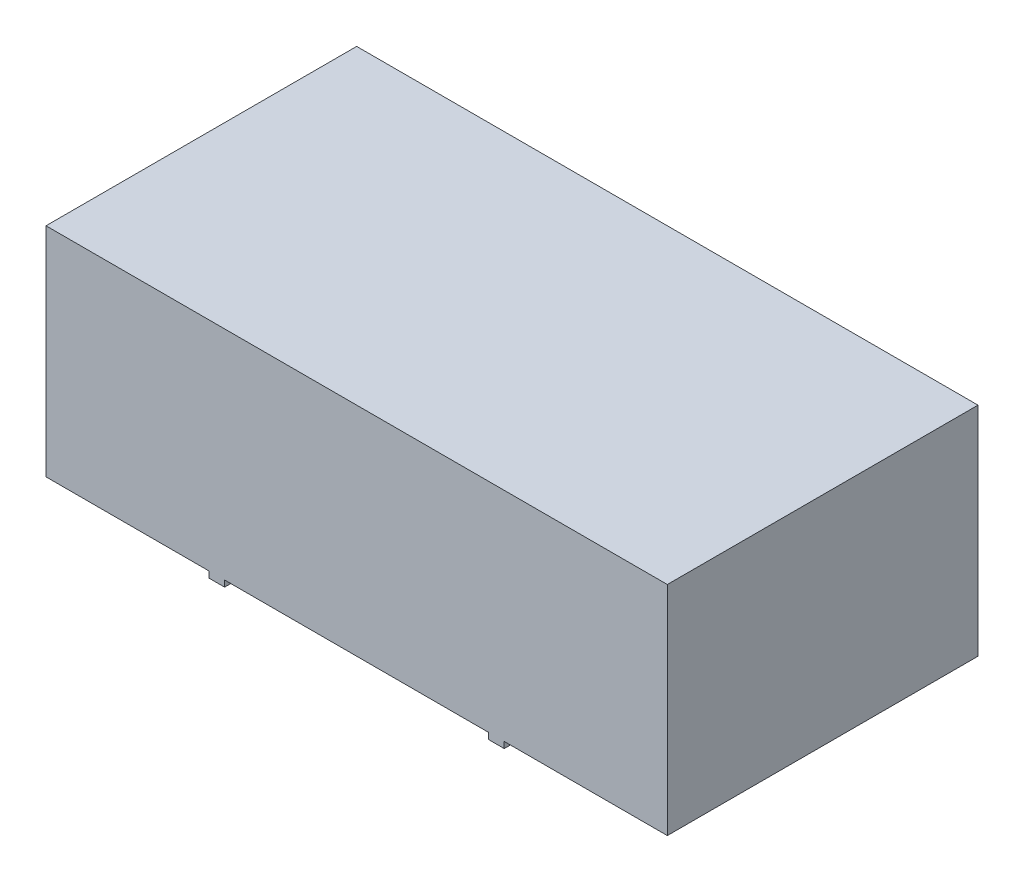
ISO-10303-21;
HEADER;
FILE_DESCRIPTION(('STEP AP214'),'2;1');
FILE_NAME('part.step','',(''),(''),'','','');
FILE_SCHEMA(('AUTOMOTIVE_DESIGN { 1 0 10303 214 1 1 1 1 }'));
ENDSEC;
DATA;
#1=APPLICATION_CONTEXT('core data for automotive mechanical design processes');
#2=APPLICATION_PROTOCOL_DEFINITION('international standard','automotive_design',2000,#1);
#3=PRODUCT_CONTEXT('',#1,'mechanical');
#4=PRODUCT('Part','Part','',(#3));
#5=PRODUCT_RELATED_PRODUCT_CATEGORY('part','',(#4));
#6=PRODUCT_DEFINITION_FORMATION('','',#4);
#7=PRODUCT_DEFINITION_CONTEXT('part definition',#1,'design');
#8=PRODUCT_DEFINITION('design','',#6,#7);
#9=PRODUCT_DEFINITION_SHAPE('','',#8);
#10=(LENGTH_UNIT() NAMED_UNIT(*) SI_UNIT(.MILLI.,.METRE.));
#11=(NAMED_UNIT(*) PLANE_ANGLE_UNIT() SI_UNIT($,.RADIAN.));
#12=(NAMED_UNIT(*) SI_UNIT($,.STERADIAN.) SOLID_ANGLE_UNIT());
#13=UNCERTAINTY_MEASURE_WITH_UNIT(LENGTH_MEASURE(1.E-05),#10,'distance_accuracy_value','');
#14=(GEOMETRIC_REPRESENTATION_CONTEXT(3) GLOBAL_UNCERTAINTY_ASSIGNED_CONTEXT((#13)) GLOBAL_UNIT_ASSIGNED_CONTEXT((#10,
#11,#12)) REPRESENTATION_CONTEXT('',''));
#15=CARTESIAN_POINT('',(0.,0.,0.));
#16=DIRECTION('',(0.,0.,1.));
#17=DIRECTION('',(1.,0.,0.));
#18=AXIS2_PLACEMENT_3D('',#15,#16,#17);
#19=CARTESIAN_POINT('',(0.,0.,0.));
#20=DIRECTION('',(0.,1.,0.));
#21=DIRECTION('',(0.,0.,1.));
#22=AXIS2_PLACEMENT_3D('',#19,#20,#21);
#23=PLANE('',#22);
#24=DIRECTION('',(0.,0.,-1.));
#25=VECTOR('',#24,1.);
#26=CARTESIAN_POINT('',(42.5,0.,0.));
#27=LINE('',#26,#25);
#28=CARTESIAN_POINT('',(42.5,0.,50.));
#29=VERTEX_POINT('',#28);
#30=CARTESIAN_POINT('',(42.5,0.,-50.));
#31=VERTEX_POINT('',#30);
#32=EDGE_CURVE('E149',#29,#31,#27,.T.);
#33=ORIENTED_EDGE('',*,*,#32,.F.);
#34=DIRECTION('',(1.,0.,0.));
#35=VECTOR('',#34,1.);
#36=CARTESIAN_POINT('',(-100.,0.,50.));
#37=LINE('',#36,#35);
#38=CARTESIAN_POINT('',(-42.5,0.,50.));
#39=VERTEX_POINT('',#38);
#40=EDGE_CURVE('E208',#39,#29,#37,.T.);
#41=ORIENTED_EDGE('',*,*,#40,.F.);
#42=DIRECTION('',(0.,0.,-1.));
#43=VECTOR('',#42,1.);
#44=CARTESIAN_POINT('',(-42.5,0.,0.));
#45=LINE('',#44,#43);
#46=CARTESIAN_POINT('',(-42.5,0.,-50.));
#47=VERTEX_POINT('',#46);
#48=EDGE_CURVE('E164',#39,#47,#45,.T.);
#49=ORIENTED_EDGE('',*,*,#48,.T.);
#50=DIRECTION('',(-1.,0.,0.));
#51=VECTOR('',#50,1.);
#52=CARTESIAN_POINT('',(-100.,0.,-50.));
#53=LINE('',#52,#51);
#54=EDGE_CURVE('E55',#31,#47,#53,.T.);
#55=ORIENTED_EDGE('',*,*,#54,.F.);
#56=EDGE_LOOP('',(#33,#41,#49,#55));
#57=FACE_BOUND('',#56,.T.);
#58=ADVANCED_FACE('F35',(#57),#23,.F.);
#59=DIRECTION('',(0.,0.,-1.));
#60=VECTOR('',#59,1.);
#61=CARTESIAN_POINT('',(-47.5,0.,0.));
#62=LINE('',#61,#60);
#63=CARTESIAN_POINT('',(-47.5,0.,50.));
#64=VERTEX_POINT('',#63);
#65=CARTESIAN_POINT('',(-47.5,0.,-50.));
#66=VERTEX_POINT('',#65);
#67=EDGE_CURVE('E134',#64,#66,#62,.T.);
#68=ORIENTED_EDGE('',*,*,#67,.F.);
#69=CARTESIAN_POINT('',(-100.,0.,50.));
#70=VERTEX_POINT('',#69);
#71=EDGE_CURVE('E191',#70,#64,#37,.T.);
#72=ORIENTED_EDGE('',*,*,#71,.F.);
#73=DIRECTION('',(0.,0.,1.));
#74=VECTOR('',#73,1.);
#75=CARTESIAN_POINT('',(-100.,0.,-50.));
#76=LINE('',#75,#74);
#77=CARTESIAN_POINT('',(-100.,0.,-50.));
#78=VERTEX_POINT('',#77);
#79=EDGE_CURVE('E204',#78,#70,#76,.T.);
#80=ORIENTED_EDGE('',*,*,#79,.F.);
#81=EDGE_CURVE('E200',#66,#78,#53,.T.);
#82=ORIENTED_EDGE('',*,*,#81,.F.);
#83=EDGE_LOOP('',(#68,#72,#80,#82));
#84=FACE_BOUND('',#83,.T.);
#85=ADVANCED_FACE('F222',(#84),#23,.F.);
#86=CARTESIAN_POINT('',(100.,70.,-50.));
#87=DIRECTION('',(-1.,0.,0.));
#88=DIRECTION('',(0.,0.,1.));
#89=AXIS2_PLACEMENT_3D('',#86,#87,#88);
#90=PLANE('',#89);
#91=DIRECTION('',(0.,0.,-1.));
#92=VECTOR('',#91,1.);
#93=CARTESIAN_POINT('',(100.,0.,-50.));
#94=LINE('',#93,#92);
#95=CARTESIAN_POINT('',(100.,0.,50.));
#96=VERTEX_POINT('',#95);
#97=CARTESIAN_POINT('',(100.,0.,-50.));
#98=VERTEX_POINT('',#97);
#99=EDGE_CURVE('E186',#96,#98,#94,.T.);
#100=ORIENTED_EDGE('',*,*,#99,.T.);
#101=DIRECTION('',(0.,-1.,0.));
#102=VECTOR('',#101,1.);
#103=CARTESIAN_POINT('',(100.,70.,-50.));
#104=LINE('',#103,#102);
#105=CARTESIAN_POINT('',(100.,70.,-50.));
#106=VERTEX_POINT('',#105);
#107=EDGE_CURVE('E11',#106,#98,#104,.T.);
#108=ORIENTED_EDGE('',*,*,#107,.F.);
#109=DIRECTION('',(0.,0.,-1.));
#110=VECTOR('',#109,1.);
#111=CARTESIAN_POINT('',(100.,70.,-50.));
#112=LINE('',#111,#110);
#113=CARTESIAN_POINT('',(100.,70.,50.));
#114=VERTEX_POINT('',#113);
#115=EDGE_CURVE('E187',#114,#106,#112,.T.);
#116=ORIENTED_EDGE('',*,*,#115,.F.);
#117=DIRECTION('',(0.,-1.,0.));
#118=VECTOR('',#117,1.);
#119=CARTESIAN_POINT('',(100.,70.,50.));
#120=LINE('',#119,#118);
#121=EDGE_CURVE('E197',#114,#96,#120,.T.);
#122=ORIENTED_EDGE('',*,*,#121,.T.);
#123=EDGE_LOOP('',(#100,#108,#116,#122));
#124=FACE_BOUND('',#123,.T.);
#125=ADVANCED_FACE('F37',(#124),#90,.F.);
#126=CARTESIAN_POINT('',(-100.,70.,-50.));
#127=DIRECTION('',(0.,0.,1.));
#128=DIRECTION('',(1.,0.,0.));
#129=AXIS2_PLACEMENT_3D('',#126,#127,#128);
#130=PLANE('',#129);
#131=CARTESIAN_POINT('',(47.5,0.,-50.));
#132=VERTEX_POINT('',#131);
#133=EDGE_CURVE('E201',#98,#132,#53,.T.);
#134=ORIENTED_EDGE('',*,*,#133,.T.);
#135=DIRECTION('',(0.,1.,0.));
#136=VECTOR('',#135,1.);
#137=CARTESIAN_POINT('',(47.5,-2.,-50.));
#138=LINE('',#137,#136);
#139=CARTESIAN_POINT('',(47.5,-2.,-50.));
#140=VERTEX_POINT('',#139);
#141=EDGE_CURVE('E155',#140,#132,#138,.T.);
#142=ORIENTED_EDGE('',*,*,#141,.F.);
#143=DIRECTION('',(1.,0.,0.));
#144=VECTOR('',#143,1.);
#145=CARTESIAN_POINT('',(0.,-2.,-50.));
#146=LINE('',#145,#144);
#147=CARTESIAN_POINT('',(42.5,-2.,-50.));
#148=VERTEX_POINT('',#147);
#149=EDGE_CURVE('E147',#148,#140,#146,.T.);
#150=ORIENTED_EDGE('',*,*,#149,.F.);
#151=DIRECTION('',(0.,1.,0.));
#152=VECTOR('',#151,1.);
#153=CARTESIAN_POINT('',(42.5,-2.,-50.));
#154=LINE('',#153,#152);
#155=EDGE_CURVE('E50',#148,#31,#154,.T.);
#156=ORIENTED_EDGE('',*,*,#155,.T.);
#157=ORIENTED_EDGE('',*,*,#54,.T.);
#158=DIRECTION('',(0.,1.,0.));
#159=VECTOR('',#158,1.);
#160=CARTESIAN_POINT('',(-42.5,-2.,-50.));
#161=LINE('',#160,#159);
#162=CARTESIAN_POINT('',(-42.5,-2.,-50.));
#163=VERTEX_POINT('',#162);
#164=EDGE_CURVE('E177',#163,#47,#161,.T.);
#165=ORIENTED_EDGE('',*,*,#164,.F.);
#166=DIRECTION('',(1.,0.,0.));
#167=VECTOR('',#166,1.);
#168=CARTESIAN_POINT('',(0.,-2.,-50.));
#169=LINE('',#168,#167);
#170=CARTESIAN_POINT('',(-47.5,-2.,-50.));
#171=VERTEX_POINT('',#170);
#172=EDGE_CURVE('E166',#171,#163,#169,.T.);
#173=ORIENTED_EDGE('',*,*,#172,.F.);
#174=DIRECTION('',(0.,1.,0.));
#175=VECTOR('',#174,1.);
#176=CARTESIAN_POINT('',(-47.5,-2.,-50.));
#177=LINE('',#176,#175);
#178=EDGE_CURVE('E180',#171,#66,#177,.T.);
#179=ORIENTED_EDGE('',*,*,#178,.T.);
#180=ORIENTED_EDGE('',*,*,#81,.T.);
#181=DIRECTION('',(0.,-1.,0.));
#182=VECTOR('',#181,1.);
#183=CARTESIAN_POINT('',(-100.,70.,-50.));
#184=LINE('',#183,#182);
#185=CARTESIAN_POINT('',(-100.,70.,-50.));
#186=VERTEX_POINT('',#185);
#187=EDGE_CURVE('E43',#186,#78,#184,.T.);
#188=ORIENTED_EDGE('',*,*,#187,.F.);
#189=DIRECTION('',(-1.,0.,0.));
#190=VECTOR('',#189,1.);
#191=CARTESIAN_POINT('',(-100.,70.,-50.));
#192=LINE('',#191,#190);
#193=EDGE_CURVE('E190',#106,#186,#192,.T.);
#194=ORIENTED_EDGE('',*,*,#193,.F.);
#195=ORIENTED_EDGE('',*,*,#107,.T.);
#196=EDGE_LOOP('',(#134,#142,#150,#156,#157,#165,#173,#179,#180,#188,#194,#195));
#197=FACE_BOUND('',#196,.T.);
#198=ADVANCED_FACE('F245',(#197),#130,.F.);
#199=CARTESIAN_POINT('',(-100.,70.,-50.));
#200=DIRECTION('',(1.,0.,0.));
#201=DIRECTION('',(0.,0.,-1.));
#202=AXIS2_PLACEMENT_3D('',#199,#200,#201);
#203=PLANE('',#202);
#204=ORIENTED_EDGE('',*,*,#79,.T.);
#205=DIRECTION('',(0.,-1.,0.));
#206=VECTOR('',#205,1.);
#207=CARTESIAN_POINT('',(-100.,70.,50.));
#208=LINE('',#207,#206);
#209=CARTESIAN_POINT('',(-100.,70.,50.));
#210=VERTEX_POINT('',#209);
#211=EDGE_CURVE('E211',#210,#70,#208,.T.);
#212=ORIENTED_EDGE('',*,*,#211,.F.);
#213=DIRECTION('',(0.,0.,1.));
#214=VECTOR('',#213,1.);
#215=CARTESIAN_POINT('',(-100.,70.,-50.));
#216=LINE('',#215,#214);
#217=EDGE_CURVE('E193',#186,#210,#216,.T.);
#218=ORIENTED_EDGE('',*,*,#217,.F.);
#219=ORIENTED_EDGE('',*,*,#187,.T.);
#220=EDGE_LOOP('',(#204,#212,#218,#219));
#221=FACE_BOUND('',#220,.T.);
#222=ADVANCED_FACE('F218',(#221),#203,.F.);
#223=CARTESIAN_POINT('',(-100.,70.,50.));
#224=DIRECTION('',(0.,0.,-1.));
#225=DIRECTION('',(-1.,0.,0.));
#226=AXIS2_PLACEMENT_3D('',#223,#224,#225);
#227=PLANE('',#226);
#228=ORIENTED_EDGE('',*,*,#71,.T.);
#229=DIRECTION('',(0.,1.,0.));
#230=VECTOR('',#229,1.);
#231=CARTESIAN_POINT('',(-47.5,-2.,50.));
#232=LINE('',#231,#230);
#233=CARTESIAN_POINT('',(-47.5,-2.,50.));
#234=VERTEX_POINT('',#233);
#235=EDGE_CURVE('E183',#234,#64,#232,.T.);
#236=ORIENTED_EDGE('',*,*,#235,.F.);
#237=DIRECTION('',(-1.,0.,0.));
#238=VECTOR('',#237,1.);
#239=CARTESIAN_POINT('',(0.,-2.,50.));
#240=LINE('',#239,#238);
#241=CARTESIAN_POINT('',(-42.5,-2.,50.));
#242=VERTEX_POINT('',#241);
#243=EDGE_CURVE('E160',#242,#234,#240,.T.);
#244=ORIENTED_EDGE('',*,*,#243,.F.);
#245=DIRECTION('',(0.,1.,0.));
#246=VECTOR('',#245,1.);
#247=CARTESIAN_POINT('',(-42.5,-2.,50.));
#248=LINE('',#247,#246);
#249=EDGE_CURVE('E171',#242,#39,#248,.T.);
#250=ORIENTED_EDGE('',*,*,#249,.T.);
#251=ORIENTED_EDGE('',*,*,#40,.T.);
#252=DIRECTION('',(0.,1.,0.));
#253=VECTOR('',#252,1.);
#254=CARTESIAN_POINT('',(42.5,-2.,50.));
#255=LINE('',#254,#253);
#256=CARTESIAN_POINT('',(42.5,-2.,50.));
#257=VERTEX_POINT('',#256);
#258=EDGE_CURVE('E135',#257,#29,#255,.T.);
#259=ORIENTED_EDGE('',*,*,#258,.F.);
#260=DIRECTION('',(-1.,0.,0.));
#261=VECTOR('',#260,1.);
#262=CARTESIAN_POINT('',(0.,-2.,50.));
#263=LINE('',#262,#261);
#264=CARTESIAN_POINT('',(47.5,-2.,50.));
#265=VERTEX_POINT('',#264);
#266=EDGE_CURVE('E138',#265,#257,#263,.T.);
#267=ORIENTED_EDGE('',*,*,#266,.F.);
#268=DIRECTION('',(0.,1.,0.));
#269=VECTOR('',#268,1.);
#270=CARTESIAN_POINT('',(47.5,-2.,50.));
#271=LINE('',#270,#269);
#272=CARTESIAN_POINT('',(47.5,0.,50.));
#273=VERTEX_POINT('',#272);
#274=EDGE_CURVE('E125',#265,#273,#271,.T.);
#275=ORIENTED_EDGE('',*,*,#274,.T.);
#276=EDGE_CURVE('E206',#273,#96,#37,.T.);
#277=ORIENTED_EDGE('',*,*,#276,.T.);
#278=ORIENTED_EDGE('',*,*,#121,.F.);
#279=DIRECTION('',(1.,0.,0.));
#280=VECTOR('',#279,1.);
#281=CARTESIAN_POINT('',(-100.,70.,50.));
#282=LINE('',#281,#280);
#283=EDGE_CURVE('E195',#210,#114,#282,.T.);
#284=ORIENTED_EDGE('',*,*,#283,.F.);
#285=ORIENTED_EDGE('',*,*,#211,.T.);
#286=EDGE_LOOP('',(#228,#236,#244,#250,#251,#259,#267,#275,#277,#278,#284,#285));
#287=FACE_BOUND('',#286,.T.);
#288=ADVANCED_FACE('F140',(#287),#227,.F.);
#289=CARTESIAN_POINT('',(0.,70.,0.));
#290=DIRECTION('',(0.,1.,0.));
#291=DIRECTION('',(0.,0.,1.));
#292=AXIS2_PLACEMENT_3D('',#289,#290,#291);
#293=PLANE('',#292);
#294=ORIENTED_EDGE('',*,*,#115,.T.);
#295=ORIENTED_EDGE('',*,*,#193,.T.);
#296=ORIENTED_EDGE('',*,*,#217,.T.);
#297=ORIENTED_EDGE('',*,*,#283,.T.);
#298=EDGE_LOOP('',(#294,#295,#296,#297));
#299=FACE_BOUND('',#298,.T.);
#300=ADVANCED_FACE('F247',(#299),#293,.T.);
#301=ORIENTED_EDGE('',*,*,#276,.F.);
#302=DIRECTION('',(0.,0.,-1.));
#303=VECTOR('',#302,1.);
#304=CARTESIAN_POINT('',(47.5,0.,0.));
#305=LINE('',#304,#303);
#306=EDGE_CURVE('E131',#273,#132,#305,.T.);
#307=ORIENTED_EDGE('',*,*,#306,.T.);
#308=ORIENTED_EDGE('',*,*,#133,.F.);
#309=ORIENTED_EDGE('',*,*,#99,.F.);
#310=EDGE_LOOP('',(#301,#307,#308,#309));
#311=FACE_BOUND('',#310,.T.);
#312=ADVANCED_FACE('F244',(#311),#23,.F.);
#313=CARTESIAN_POINT('',(-47.5,-2.,0.));
#314=DIRECTION('',(1.,0.,0.));
#315=DIRECTION('',(0.,0.,-1.));
#316=AXIS2_PLACEMENT_3D('',#313,#314,#315);
#317=PLANE('',#316);
#318=ORIENTED_EDGE('',*,*,#67,.T.);
#319=ORIENTED_EDGE('',*,*,#178,.F.);
#320=DIRECTION('',(0.,0.,-1.));
#321=VECTOR('',#320,1.);
#322=CARTESIAN_POINT('',(-47.5,-2.,0.));
#323=LINE('',#322,#321);
#324=EDGE_CURVE('E163',#234,#171,#323,.T.);
#325=ORIENTED_EDGE('',*,*,#324,.F.);
#326=ORIENTED_EDGE('',*,*,#235,.T.);
#327=EDGE_LOOP('',(#318,#319,#325,#326));
#328=FACE_BOUND('',#327,.T.);
#329=ADVANCED_FACE('F227',(#328),#317,.F.);
#330=CARTESIAN_POINT('',(-42.5,-2.,0.));
#331=DIRECTION('',(1.,0.,0.));
#332=DIRECTION('',(0.,0.,-1.));
#333=AXIS2_PLACEMENT_3D('',#330,#331,#332);
#334=PLANE('',#333);
#335=ORIENTED_EDGE('',*,*,#48,.F.);
#336=ORIENTED_EDGE('',*,*,#249,.F.);
#337=DIRECTION('',(0.,0.,-1.));
#338=VECTOR('',#337,1.);
#339=CARTESIAN_POINT('',(-42.5,-2.,0.));
#340=LINE('',#339,#338);
#341=EDGE_CURVE('E168',#242,#163,#340,.T.);
#342=ORIENTED_EDGE('',*,*,#341,.T.);
#343=ORIENTED_EDGE('',*,*,#164,.T.);
#344=EDGE_LOOP('',(#335,#336,#342,#343));
#345=FACE_BOUND('',#344,.T.);
#346=ADVANCED_FACE('F235',(#345),#334,.T.);
#347=CARTESIAN_POINT('',(0.,-2.,0.));
#348=DIRECTION('',(0.,-1.,0.));
#349=DIRECTION('',(0.,0.,-1.));
#350=AXIS2_PLACEMENT_3D('',#347,#348,#349);
#351=PLANE('',#350);
#352=ORIENTED_EDGE('',*,*,#243,.T.);
#353=ORIENTED_EDGE('',*,*,#324,.T.);
#354=ORIENTED_EDGE('',*,*,#172,.T.);
#355=ORIENTED_EDGE('',*,*,#341,.F.);
#356=EDGE_LOOP('',(#352,#353,#354,#355));
#357=FACE_BOUND('',#356,.T.);
#358=ADVANCED_FACE('F232',(#357),#351,.T.);
#359=CARTESIAN_POINT('',(47.5,-2.,0.));
#360=DIRECTION('',(1.,0.,0.));
#361=DIRECTION('',(0.,0.,-1.));
#362=AXIS2_PLACEMENT_3D('',#359,#360,#361);
#363=PLANE('',#362);
#364=ORIENTED_EDGE('',*,*,#306,.F.);
#365=ORIENTED_EDGE('',*,*,#274,.F.);
#366=DIRECTION('',(0.,0.,-1.));
#367=VECTOR('',#366,1.);
#368=CARTESIAN_POINT('',(47.5,-2.,0.));
#369=LINE('',#368,#367);
#370=EDGE_CURVE('E129',#265,#140,#369,.T.);
#371=ORIENTED_EDGE('',*,*,#370,.T.);
#372=ORIENTED_EDGE('',*,*,#141,.T.);
#373=EDGE_LOOP('',(#364,#365,#371,#372));
#374=FACE_BOUND('',#373,.T.);
#375=ADVANCED_FACE('F127',(#374),#363,.T.);
#376=CARTESIAN_POINT('',(42.5,-2.,0.));
#377=DIRECTION('',(1.,0.,0.));
#378=DIRECTION('',(0.,0.,-1.));
#379=AXIS2_PLACEMENT_3D('',#376,#377,#378);
#380=PLANE('',#379);
#381=ORIENTED_EDGE('',*,*,#32,.T.);
#382=ORIENTED_EDGE('',*,*,#155,.F.);
#383=DIRECTION('',(0.,0.,-1.));
#384=VECTOR('',#383,1.);
#385=CARTESIAN_POINT('',(42.5,-2.,0.));
#386=LINE('',#385,#384);
#387=EDGE_CURVE('E144',#257,#148,#386,.T.);
#388=ORIENTED_EDGE('',*,*,#387,.F.);
#389=ORIENTED_EDGE('',*,*,#258,.T.);
#390=EDGE_LOOP('',(#381,#382,#388,#389));
#391=FACE_BOUND('',#390,.T.);
#392=ADVANCED_FACE('F358',(#391),#380,.F.);
#393=CARTESIAN_POINT('',(0.,-2.,0.));
#394=DIRECTION('',(0.,-1.,0.));
#395=DIRECTION('',(0.,0.,-1.));
#396=AXIS2_PLACEMENT_3D('',#393,#394,#395);
#397=PLANE('',#396);
#398=ORIENTED_EDGE('',*,*,#370,.F.);
#399=ORIENTED_EDGE('',*,*,#266,.T.);
#400=ORIENTED_EDGE('',*,*,#387,.T.);
#401=ORIENTED_EDGE('',*,*,#149,.T.);
#402=EDGE_LOOP('',(#398,#399,#400,#401));
#403=FACE_BOUND('',#402,.T.);
#404=ADVANCED_FACE('F146',(#403),#397,.T.);
#405=CLOSED_SHELL('',(#58,#85,#125,#198,#222,#288,#300,#312,#329,#346,#358,#375,#392,#404));
#406=MANIFOLD_SOLID_BREP('B2',#405);
#407=ADVANCED_BREP_SHAPE_REPRESENTATION('',(#18,#406),#14);
#408=SHAPE_DEFINITION_REPRESENTATION(#9,#407);
ENDSEC;
END-ISO-10303-21;
